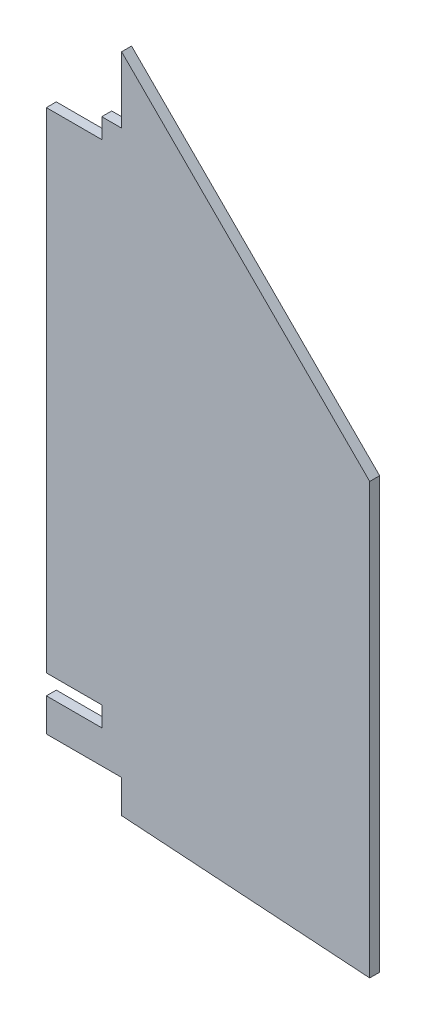
ISO-10303-21;
HEADER;
FILE_DESCRIPTION(('STEP AP214'),'2;1');
FILE_NAME('part.step','',(''),(''),'','','');
FILE_SCHEMA(('AUTOMOTIVE_DESIGN { 1 0 10303 214 1 1 1 1 }'));
ENDSEC;
DATA;
#1=APPLICATION_CONTEXT('core data for automotive mechanical design processes');
#2=APPLICATION_PROTOCOL_DEFINITION('international standard','automotive_design',2000,#1);
#3=PRODUCT_CONTEXT('',#1,'mechanical');
#4=PRODUCT('Part','Part','',(#3));
#5=PRODUCT_RELATED_PRODUCT_CATEGORY('part','',(#4));
#6=PRODUCT_DEFINITION_FORMATION('','',#4);
#7=PRODUCT_DEFINITION_CONTEXT('part definition',#1,'design');
#8=PRODUCT_DEFINITION('design','',#6,#7);
#9=PRODUCT_DEFINITION_SHAPE('','',#8);
#10=(LENGTH_UNIT() NAMED_UNIT(*) SI_UNIT(.MILLI.,.METRE.));
#11=(NAMED_UNIT(*) PLANE_ANGLE_UNIT() SI_UNIT($,.RADIAN.));
#12=(NAMED_UNIT(*) SI_UNIT($,.STERADIAN.) SOLID_ANGLE_UNIT());
#13=UNCERTAINTY_MEASURE_WITH_UNIT(LENGTH_MEASURE(1.E-05),#10,'distance_accuracy_value','');
#14=(GEOMETRIC_REPRESENTATION_CONTEXT(3) GLOBAL_UNCERTAINTY_ASSIGNED_CONTEXT((#13)) GLOBAL_UNIT_ASSIGNED_CONTEXT((#10,
#11,#12)) REPRESENTATION_CONTEXT('',''));
#15=CARTESIAN_POINT('',(0.,0.,0.));
#16=DIRECTION('',(0.,0.,1.));
#17=DIRECTION('',(1.,0.,0.));
#18=AXIS2_PLACEMENT_3D('',#15,#16,#17);
#19=CARTESIAN_POINT('',(-44.9481865284975,7.69430051813452,3.));
#20=DIRECTION('',(0.0665190105237766,0.997785157856609,0.));
#21=DIRECTION('',(-0.997785157856609,0.0665190105237766,0.));
#22=AXIS2_PLACEMENT_3D('',#19,#20,#21);
#23=PLANE('',#22);
#24=DIRECTION('',(0.997785157856609,-0.0665190105237766,0.));
#25=VECTOR('',#24,1.);
#26=CARTESIAN_POINT('',(-44.9481865284975,7.69430051813452,0.));
#27=LINE('',#26,#25);
#28=CARTESIAN_POINT('',(-119.948186528497,12.6943005181347,0.));
#29=VERTEX_POINT('',#28);
#30=CARTESIAN_POINT('',(-44.9481865284975,7.69430051813452,0.));
#31=VERTEX_POINT('',#30);
#32=EDGE_CURVE('E174',#29,#31,#27,.T.);
#33=ORIENTED_EDGE('',*,*,#32,.T.);
#34=DIRECTION('',(0.,0.,-1.));
#35=VECTOR('',#34,1.);
#36=CARTESIAN_POINT('',(-44.9481865284975,7.69430051813452,3.));
#37=LINE('',#36,#35);
#38=CARTESIAN_POINT('',(-44.9481865284975,7.69430051813452,3.));
#39=VERTEX_POINT('',#38);
#40=EDGE_CURVE('E11',#39,#31,#37,.T.);
#41=ORIENTED_EDGE('',*,*,#40,.F.);
#42=DIRECTION('',(0.997785157856609,-0.0665190105237766,0.));
#43=VECTOR('',#42,1.);
#44=CARTESIAN_POINT('',(-44.9481865284975,7.69430051813452,3.));
#45=LINE('',#44,#43);
#46=CARTESIAN_POINT('',(-119.948186528497,12.6943005181347,3.));
#47=VERTEX_POINT('',#46);
#48=EDGE_CURVE('E200',#47,#39,#45,.T.);
#49=ORIENTED_EDGE('',*,*,#48,.F.);
#50=DIRECTION('',(0.,0.,-1.));
#51=VECTOR('',#50,1.);
#52=CARTESIAN_POINT('',(-119.948186528497,12.6943005181347,3.));
#53=LINE('',#52,#51);
#54=EDGE_CURVE('E170',#47,#29,#53,.T.);
#55=ORIENTED_EDGE('',*,*,#54,.T.);
#56=EDGE_LOOP('',(#33,#41,#49,#55));
#57=FACE_BOUND('',#56,.T.);
#58=ADVANCED_FACE('F42',(#57),#23,.F.);
#59=CARTESIAN_POINT('',(-44.9481865284975,7.69430051813452,3.));
#60=DIRECTION('',(-1.,0.,0.));
#61=DIRECTION('',(0.,0.,1.));
#62=AXIS2_PLACEMENT_3D('',#59,#60,#61);
#63=PLANE('',#62);
#64=DIRECTION('',(0.,1.,0.));
#65=VECTOR('',#64,1.);
#66=CARTESIAN_POINT('',(-44.9481865284975,7.69430051813452,0.));
#67=LINE('',#66,#65);
#68=CARTESIAN_POINT('',(-44.9481865284975,137.694300518135,0.));
#69=VERTEX_POINT('',#68);
#70=EDGE_CURVE('E177',#31,#69,#67,.T.);
#71=ORIENTED_EDGE('',*,*,#70,.T.);
#72=DIRECTION('',(0.,0.,-1.));
#73=VECTOR('',#72,1.);
#74=CARTESIAN_POINT('',(-44.9481865284975,137.694300518135,3.));
#75=LINE('',#74,#73);
#76=CARTESIAN_POINT('',(-44.9481865284975,137.694300518135,3.));
#77=VERTEX_POINT('',#76);
#78=EDGE_CURVE('E50',#77,#69,#75,.T.);
#79=ORIENTED_EDGE('',*,*,#78,.F.);
#80=DIRECTION('',(0.,1.,0.));
#81=VECTOR('',#80,1.);
#82=CARTESIAN_POINT('',(-44.9481865284975,7.69430051813452,3.));
#83=LINE('',#82,#81);
#84=EDGE_CURVE('E119',#39,#77,#83,.T.);
#85=ORIENTED_EDGE('',*,*,#84,.F.);
#86=ORIENTED_EDGE('',*,*,#40,.T.);
#87=EDGE_LOOP('',(#71,#79,#85,#86));
#88=FACE_BOUND('',#87,.T.);
#89=ADVANCED_FACE('F288',(#88),#63,.F.);
#90=CARTESIAN_POINT('',(-119.948186528497,212.694300518135,3.));
#91=DIRECTION('',(-0.707106781186548,-0.707106781186547,0.));
#92=DIRECTION('',(0.707106781186547,-0.707106781186548,0.));
#93=AXIS2_PLACEMENT_3D('',#90,#91,#92);
#94=PLANE('',#93);
#95=DIRECTION('',(-0.707106781186547,0.707106781186548,0.));
#96=VECTOR('',#95,1.);
#97=CARTESIAN_POINT('',(-119.948186528497,212.694300518135,0.));
#98=LINE('',#97,#96);
#99=CARTESIAN_POINT('',(-119.948186528497,212.694300518135,0.));
#100=VERTEX_POINT('',#99);
#101=EDGE_CURVE('E179',#69,#100,#98,.T.);
#102=ORIENTED_EDGE('',*,*,#101,.T.);
#103=DIRECTION('',(0.,0.,-1.));
#104=VECTOR('',#103,1.);
#105=CARTESIAN_POINT('',(-119.948186528497,212.694300518135,3.));
#106=LINE('',#105,#104);
#107=CARTESIAN_POINT('',(-119.948186528497,212.694300518135,3.));
#108=VERTEX_POINT('',#107);
#109=EDGE_CURVE('E225',#108,#100,#106,.T.);
#110=ORIENTED_EDGE('',*,*,#109,.F.);
#111=DIRECTION('',(-0.707106781186547,0.707106781186548,0.));
#112=VECTOR('',#111,1.);
#113=CARTESIAN_POINT('',(-119.948186528497,212.694300518135,3.));
#114=LINE('',#113,#112);
#115=EDGE_CURVE('E233',#77,#108,#114,.T.);
#116=ORIENTED_EDGE('',*,*,#115,.F.);
#117=ORIENTED_EDGE('',*,*,#78,.T.);
#118=EDGE_LOOP('',(#102,#110,#116,#117));
#119=FACE_BOUND('',#118,.T.);
#120=ADVANCED_FACE('F231',(#119),#94,.F.);
#121=CARTESIAN_POINT('',(-119.948186528497,192.694300518135,3.));
#122=DIRECTION('',(1.,0.,0.));
#123=DIRECTION('',(0.,1.,0.));
#124=AXIS2_PLACEMENT_3D('',#121,#122,#123);
#125=PLANE('',#124);
#126=DIRECTION('',(0.,-1.,0.));
#127=VECTOR('',#126,1.);
#128=CARTESIAN_POINT('',(-119.948186528497,192.694300518135,0.));
#129=LINE('',#128,#127);
#130=CARTESIAN_POINT('',(-119.948186528497,192.694300518135,0.));
#131=VERTEX_POINT('',#130);
#132=EDGE_CURVE('E181',#100,#131,#129,.T.);
#133=ORIENTED_EDGE('',*,*,#132,.T.);
#134=DIRECTION('',(0.,0.,-1.));
#135=VECTOR('',#134,1.);
#136=CARTESIAN_POINT('',(-119.948186528497,192.694300518135,3.));
#137=LINE('',#136,#135);
#138=CARTESIAN_POINT('',(-119.948186528497,192.694300518135,3.));
#139=VERTEX_POINT('',#138);
#140=EDGE_CURVE('E222',#139,#131,#137,.T.);
#141=ORIENTED_EDGE('',*,*,#140,.F.);
#142=DIRECTION('',(0.,-1.,0.));
#143=VECTOR('',#142,1.);
#144=CARTESIAN_POINT('',(-119.948186528497,192.694300518135,3.));
#145=LINE('',#144,#143);
#146=EDGE_CURVE('E251',#108,#139,#145,.T.);
#147=ORIENTED_EDGE('',*,*,#146,.F.);
#148=ORIENTED_EDGE('',*,*,#109,.T.);
#149=EDGE_LOOP('',(#133,#141,#147,#148));
#150=FACE_BOUND('',#149,.T.);
#151=ADVANCED_FACE('F242',(#150),#125,.F.);
#152=CARTESIAN_POINT('',(-119.948186528497,192.694300518135,3.));
#153=DIRECTION('',(0.,-1.,0.));
#154=DIRECTION('',(0.,0.,-1.));
#155=AXIS2_PLACEMENT_3D('',#152,#153,#154);
#156=PLANE('',#155);
#157=DIRECTION('',(-1.,0.,0.));
#158=VECTOR('',#157,1.);
#159=CARTESIAN_POINT('',(-119.948186528497,192.694300518135,0.));
#160=LINE('',#159,#158);
#161=CARTESIAN_POINT('',(-125.948186528497,192.694300518135,0.));
#162=VERTEX_POINT('',#161);
#163=EDGE_CURVE('E183',#131,#162,#160,.T.);
#164=ORIENTED_EDGE('',*,*,#163,.T.);
#165=DIRECTION('',(0.,0.,-1.));
#166=VECTOR('',#165,1.);
#167=CARTESIAN_POINT('',(-125.948186528497,192.694300518135,3.));
#168=LINE('',#167,#166);
#169=CARTESIAN_POINT('',(-125.948186528497,192.694300518135,3.));
#170=VERTEX_POINT('',#169);
#171=EDGE_CURVE('E219',#170,#162,#168,.T.);
#172=ORIENTED_EDGE('',*,*,#171,.F.);
#173=DIRECTION('',(-1.,0.,0.));
#174=VECTOR('',#173,1.);
#175=CARTESIAN_POINT('',(-119.948186528497,192.694300518135,3.));
#176=LINE('',#175,#174);
#177=EDGE_CURVE('E248',#139,#170,#176,.T.);
#178=ORIENTED_EDGE('',*,*,#177,.F.);
#179=ORIENTED_EDGE('',*,*,#140,.T.);
#180=EDGE_LOOP('',(#164,#172,#178,#179));
#181=FACE_BOUND('',#180,.T.);
#182=ADVANCED_FACE('F246',(#181),#156,.F.);
#183=CARTESIAN_POINT('',(-125.948186528497,192.694300518135,3.));
#184=DIRECTION('',(1.,0.,0.));
#185=DIRECTION('',(0.,0.,-1.));
#186=AXIS2_PLACEMENT_3D('',#183,#184,#185);
#187=PLANE('',#186);
#188=DIRECTION('',(0.,-1.,0.));
#189=VECTOR('',#188,1.);
#190=CARTESIAN_POINT('',(-125.948186528497,192.694300518135,0.));
#191=LINE('',#190,#189);
#192=CARTESIAN_POINT('',(-125.948186528497,186.694300518135,0.));
#193=VERTEX_POINT('',#192);
#194=EDGE_CURVE('E185',#162,#193,#191,.T.);
#195=ORIENTED_EDGE('',*,*,#194,.T.);
#196=DIRECTION('',(0.,0.,-1.));
#197=VECTOR('',#196,1.);
#198=CARTESIAN_POINT('',(-125.948186528497,186.694300518135,3.));
#199=LINE('',#198,#197);
#200=CARTESIAN_POINT('',(-125.948186528497,186.694300518135,3.));
#201=VERTEX_POINT('',#200);
#202=EDGE_CURVE('E216',#201,#193,#199,.T.);
#203=ORIENTED_EDGE('',*,*,#202,.F.);
#204=DIRECTION('',(0.,-1.,0.));
#205=VECTOR('',#204,1.);
#206=CARTESIAN_POINT('',(-125.948186528497,192.694300518135,3.));
#207=LINE('',#206,#205);
#208=EDGE_CURVE('E250',#170,#201,#207,.T.);
#209=ORIENTED_EDGE('',*,*,#208,.F.);
#210=ORIENTED_EDGE('',*,*,#171,.T.);
#211=EDGE_LOOP('',(#195,#203,#209,#210));
#212=FACE_BOUND('',#211,.T.);
#213=ADVANCED_FACE('F301',(#212),#187,.F.);
#214=CARTESIAN_POINT('',(-125.948186528497,186.694300518135,3.));
#215=DIRECTION('',(0.,-1.,0.));
#216=DIRECTION('',(0.,0.,-1.));
#217=AXIS2_PLACEMENT_3D('',#214,#215,#216);
#218=PLANE('',#217);
#219=DIRECTION('',(-1.,0.,0.));
#220=VECTOR('',#219,1.);
#221=CARTESIAN_POINT('',(-125.948186528497,186.694300518135,0.));
#222=LINE('',#221,#220);
#223=CARTESIAN_POINT('',(-142.698186528497,186.694300518135,0.));
#224=VERTEX_POINT('',#223);
#225=EDGE_CURVE('E187',#193,#224,#222,.T.);
#226=ORIENTED_EDGE('',*,*,#225,.T.);
#227=DIRECTION('',(0.,0.,-1.));
#228=VECTOR('',#227,1.);
#229=CARTESIAN_POINT('',(-142.698186528497,186.694300518135,3.));
#230=LINE('',#229,#228);
#231=CARTESIAN_POINT('',(-142.698186528497,186.694300518135,3.));
#232=VERTEX_POINT('',#231);
#233=EDGE_CURVE('E213',#232,#224,#230,.T.);
#234=ORIENTED_EDGE('',*,*,#233,.F.);
#235=DIRECTION('',(-1.,0.,0.));
#236=VECTOR('',#235,1.);
#237=CARTESIAN_POINT('',(-125.948186528497,186.694300518135,3.));
#238=LINE('',#237,#236);
#239=EDGE_CURVE('E253',#201,#232,#238,.T.);
#240=ORIENTED_EDGE('',*,*,#239,.F.);
#241=ORIENTED_EDGE('',*,*,#202,.T.);
#242=EDGE_LOOP('',(#226,#234,#240,#241));
#243=FACE_BOUND('',#242,.T.);
#244=ADVANCED_FACE('F304',(#243),#218,.F.);
#245=CARTESIAN_POINT('',(-142.698186528497,38.6943005181347,3.));
#246=DIRECTION('',(1.,0.,0.));
#247=DIRECTION('',(0.,0.,-1.));
#248=AXIS2_PLACEMENT_3D('',#245,#246,#247);
#249=PLANE('',#248);
#250=DIRECTION('',(0.,-1.,0.));
#251=VECTOR('',#250,1.);
#252=CARTESIAN_POINT('',(-142.698186528497,38.6943005181347,0.));
#253=LINE('',#252,#251);
#254=CARTESIAN_POINT('',(-142.698186528497,38.6943005181347,0.));
#255=VERTEX_POINT('',#254);
#256=EDGE_CURVE('E189',#224,#255,#253,.T.);
#257=ORIENTED_EDGE('',*,*,#256,.T.);
#258=DIRECTION('',(0.,0.,-1.));
#259=VECTOR('',#258,1.);
#260=CARTESIAN_POINT('',(-142.698186528497,38.6943005181347,3.));
#261=LINE('',#260,#259);
#262=CARTESIAN_POINT('',(-142.698186528497,38.6943005181347,3.));
#263=VERTEX_POINT('',#262);
#264=EDGE_CURVE('E210',#263,#255,#261,.T.);
#265=ORIENTED_EDGE('',*,*,#264,.F.);
#266=DIRECTION('',(0.,-1.,0.));
#267=VECTOR('',#266,1.);
#268=CARTESIAN_POINT('',(-142.698186528497,38.6943005181347,3.));
#269=LINE('',#268,#267);
#270=EDGE_CURVE('E259',#232,#263,#269,.T.);
#271=ORIENTED_EDGE('',*,*,#270,.F.);
#272=ORIENTED_EDGE('',*,*,#233,.T.);
#273=EDGE_LOOP('',(#257,#265,#271,#272));
#274=FACE_BOUND('',#273,.T.);
#275=ADVANCED_FACE('F308',(#274),#249,.F.);
#276=CARTESIAN_POINT('',(-125.948186528497,38.6943005181347,3.));
#277=DIRECTION('',(0.,1.,0.));
#278=DIRECTION('',(0.,0.,1.));
#279=AXIS2_PLACEMENT_3D('',#276,#277,#278);
#280=PLANE('',#279);
#281=DIRECTION('',(1.,0.,0.));
#282=VECTOR('',#281,1.);
#283=CARTESIAN_POINT('',(-125.948186528497,38.6943005181347,0.));
#284=LINE('',#283,#282);
#285=CARTESIAN_POINT('',(-125.948186528497,38.6943005181347,0.));
#286=VERTEX_POINT('',#285);
#287=EDGE_CURVE('E191',#255,#286,#284,.T.);
#288=ORIENTED_EDGE('',*,*,#287,.T.);
#289=DIRECTION('',(0.,0.,-1.));
#290=VECTOR('',#289,1.);
#291=CARTESIAN_POINT('',(-125.948186528497,38.6943005181347,3.));
#292=LINE('',#291,#290);
#293=CARTESIAN_POINT('',(-125.948186528497,38.6943005181347,3.));
#294=VERTEX_POINT('',#293);
#295=EDGE_CURVE('E207',#294,#286,#292,.T.);
#296=ORIENTED_EDGE('',*,*,#295,.F.);
#297=DIRECTION('',(1.,0.,0.));
#298=VECTOR('',#297,1.);
#299=CARTESIAN_POINT('',(-125.948186528497,38.6943005181347,3.));
#300=LINE('',#299,#298);
#301=EDGE_CURVE('E261',#263,#294,#300,.T.);
#302=ORIENTED_EDGE('',*,*,#301,.F.);
#303=ORIENTED_EDGE('',*,*,#264,.T.);
#304=EDGE_LOOP('',(#288,#296,#302,#303));
#305=FACE_BOUND('',#304,.T.);
#306=ADVANCED_FACE('F312',(#305),#280,.F.);
#307=CARTESIAN_POINT('',(-125.948186528497,32.6943005181347,3.));
#308=DIRECTION('',(1.,0.,0.));
#309=DIRECTION('',(0.,0.,-1.));
#310=AXIS2_PLACEMENT_3D('',#307,#308,#309);
#311=PLANE('',#310);
#312=DIRECTION('',(0.,-1.,0.));
#313=VECTOR('',#312,1.);
#314=CARTESIAN_POINT('',(-125.948186528497,32.6943005181347,0.));
#315=LINE('',#314,#313);
#316=CARTESIAN_POINT('',(-125.948186528497,32.6943005181347,0.));
#317=VERTEX_POINT('',#316);
#318=EDGE_CURVE('E193',#286,#317,#315,.T.);
#319=ORIENTED_EDGE('',*,*,#318,.T.);
#320=DIRECTION('',(0.,0.,-1.));
#321=VECTOR('',#320,1.);
#322=CARTESIAN_POINT('',(-125.948186528497,32.6943005181347,3.));
#323=LINE('',#322,#321);
#324=CARTESIAN_POINT('',(-125.948186528497,32.6943005181347,3.));
#325=VERTEX_POINT('',#324);
#326=EDGE_CURVE('E204',#325,#317,#323,.T.);
#327=ORIENTED_EDGE('',*,*,#326,.F.);
#328=DIRECTION('',(0.,-1.,0.));
#329=VECTOR('',#328,1.);
#330=CARTESIAN_POINT('',(-125.948186528497,32.6943005181347,3.));
#331=LINE('',#330,#329);
#332=EDGE_CURVE('E263',#294,#325,#331,.T.);
#333=ORIENTED_EDGE('',*,*,#332,.F.);
#334=ORIENTED_EDGE('',*,*,#295,.T.);
#335=EDGE_LOOP('',(#319,#327,#333,#334));
#336=FACE_BOUND('',#335,.T.);
#337=ADVANCED_FACE('F269',(#336),#311,.F.);
#338=CARTESIAN_POINT('',(-142.698186528497,32.6943005181347,3.));
#339=DIRECTION('',(0.,-1.,0.));
#340=DIRECTION('',(0.,0.,-1.));
#341=AXIS2_PLACEMENT_3D('',#338,#339,#340);
#342=PLANE('',#341);
#343=DIRECTION('',(-1.,0.,0.));
#344=VECTOR('',#343,1.);
#345=CARTESIAN_POINT('',(-142.698186528497,32.6943005181347,0.));
#346=LINE('',#345,#344);
#347=CARTESIAN_POINT('',(-142.698186528497,32.6943005181347,0.));
#348=VERTEX_POINT('',#347);
#349=EDGE_CURVE('E195',#317,#348,#346,.T.);
#350=ORIENTED_EDGE('',*,*,#349,.T.);
#351=DIRECTION('',(0.,0.,-1.));
#352=VECTOR('',#351,1.);
#353=CARTESIAN_POINT('',(-142.698186528497,32.6943005181347,3.));
#354=LINE('',#353,#352);
#355=CARTESIAN_POINT('',(-142.698186528497,32.6943005181347,3.));
#356=VERTEX_POINT('',#355);
#357=EDGE_CURVE('E165',#356,#348,#354,.T.);
#358=ORIENTED_EDGE('',*,*,#357,.F.);
#359=DIRECTION('',(-1.,0.,0.));
#360=VECTOR('',#359,1.);
#361=CARTESIAN_POINT('',(-142.698186528497,32.6943005181347,3.));
#362=LINE('',#361,#360);
#363=EDGE_CURVE('E156',#325,#356,#362,.T.);
#364=ORIENTED_EDGE('',*,*,#363,.F.);
#365=ORIENTED_EDGE('',*,*,#326,.T.);
#366=EDGE_LOOP('',(#350,#358,#364,#365));
#367=FACE_BOUND('',#366,.T.);
#368=ADVANCED_FACE('F273',(#367),#342,.F.);
#369=CARTESIAN_POINT('',(-142.698186528497,22.6943005181347,3.));
#370=DIRECTION('',(1.,0.,0.));
#371=DIRECTION('',(0.,0.,-1.));
#372=AXIS2_PLACEMENT_3D('',#369,#370,#371);
#373=PLANE('',#372);
#374=DIRECTION('',(0.,-1.,0.));
#375=VECTOR('',#374,1.);
#376=CARTESIAN_POINT('',(-142.698186528497,22.6943005181347,0.));
#377=LINE('',#376,#375);
#378=CARTESIAN_POINT('',(-142.698186528497,22.6943005181347,0.));
#379=VERTEX_POINT('',#378);
#380=EDGE_CURVE('E164',#348,#379,#377,.T.);
#381=ORIENTED_EDGE('',*,*,#380,.T.);
#382=DIRECTION('',(0.,0.,-1.));
#383=VECTOR('',#382,1.);
#384=CARTESIAN_POINT('',(-142.698186528497,22.6943005181347,3.));
#385=LINE('',#384,#383);
#386=CARTESIAN_POINT('',(-142.698186528497,22.6943005181347,3.));
#387=VERTEX_POINT('',#386);
#388=EDGE_CURVE('E161',#387,#379,#385,.T.);
#389=ORIENTED_EDGE('',*,*,#388,.F.);
#390=DIRECTION('',(0.,-1.,0.));
#391=VECTOR('',#390,1.);
#392=CARTESIAN_POINT('',(-142.698186528497,22.6943005181347,3.));
#393=LINE('',#392,#391);
#394=EDGE_CURVE('E150',#356,#387,#393,.T.);
#395=ORIENTED_EDGE('',*,*,#394,.F.);
#396=ORIENTED_EDGE('',*,*,#357,.T.);
#397=EDGE_LOOP('',(#381,#389,#395,#396));
#398=FACE_BOUND('',#397,.T.);
#399=ADVANCED_FACE('F162',(#398),#373,.F.);
#400=CARTESIAN_POINT('',(-119.948186528497,22.6943005181347,3.));
#401=DIRECTION('',(0.,1.,0.));
#402=DIRECTION('',(-1.,0.,0.));
#403=AXIS2_PLACEMENT_3D('',#400,#401,#402);
#404=PLANE('',#403);
#405=DIRECTION('',(1.,0.,0.));
#406=VECTOR('',#405,1.);
#407=CARTESIAN_POINT('',(-119.948186528497,22.6943005181347,0.));
#408=LINE('',#407,#406);
#409=CARTESIAN_POINT('',(-119.948186528497,22.6943005181347,0.));
#410=VERTEX_POINT('',#409);
#411=EDGE_CURVE('E105',#379,#410,#408,.T.);
#412=ORIENTED_EDGE('',*,*,#411,.T.);
#413=DIRECTION('',(0.,0.,-1.));
#414=VECTOR('',#413,1.);
#415=CARTESIAN_POINT('',(-119.948186528497,22.6943005181347,3.));
#416=LINE('',#415,#414);
#417=CARTESIAN_POINT('',(-119.948186528497,22.6943005181347,3.));
#418=VERTEX_POINT('',#417);
#419=EDGE_CURVE('E166',#418,#410,#416,.T.);
#420=ORIENTED_EDGE('',*,*,#419,.F.);
#421=DIRECTION('',(1.,0.,0.));
#422=VECTOR('',#421,1.);
#423=CARTESIAN_POINT('',(-119.948186528497,22.6943005181347,3.));
#424=LINE('',#423,#422);
#425=EDGE_CURVE('E154',#387,#418,#424,.T.);
#426=ORIENTED_EDGE('',*,*,#425,.F.);
#427=ORIENTED_EDGE('',*,*,#388,.T.);
#428=EDGE_LOOP('',(#412,#420,#426,#427));
#429=FACE_BOUND('',#428,.T.);
#430=ADVANCED_FACE('F168',(#429),#404,.F.);
#431=CARTESIAN_POINT('',(-119.948186528497,12.6943005181347,3.));
#432=DIRECTION('',(1.,0.,0.));
#433=DIRECTION('',(0.,0.,-1.));
#434=AXIS2_PLACEMENT_3D('',#431,#432,#433);
#435=PLANE('',#434);
#436=DIRECTION('',(0.,-1.,0.));
#437=VECTOR('',#436,1.);
#438=CARTESIAN_POINT('',(-119.948186528497,12.6943005181347,0.));
#439=LINE('',#438,#437);
#440=EDGE_CURVE('E111',#410,#29,#439,.T.);
#441=ORIENTED_EDGE('',*,*,#440,.T.);
#442=ORIENTED_EDGE('',*,*,#54,.F.);
#443=DIRECTION('',(0.,-1.,0.));
#444=VECTOR('',#443,1.);
#445=CARTESIAN_POINT('',(-119.948186528497,12.6943005181347,3.));
#446=LINE('',#445,#444);
#447=EDGE_CURVE('E58',#418,#47,#446,.T.);
#448=ORIENTED_EDGE('',*,*,#447,.F.);
#449=ORIENTED_EDGE('',*,*,#419,.T.);
#450=EDGE_LOOP('',(#441,#442,#448,#449));
#451=FACE_BOUND('',#450,.T.);
#452=ADVANCED_FACE('F277',(#451),#435,.F.);
#453=CARTESIAN_POINT('',(0.,0.,3.));
#454=DIRECTION('',(0.,0.,-1.));
#455=DIRECTION('',(-1.,0.,0.));
#456=AXIS2_PLACEMENT_3D('',#453,#454,#455);
#457=PLANE('',#456);
#458=ORIENTED_EDGE('',*,*,#48,.T.);
#459=ORIENTED_EDGE('',*,*,#84,.T.);
#460=ORIENTED_EDGE('',*,*,#115,.T.);
#461=ORIENTED_EDGE('',*,*,#146,.T.);
#462=ORIENTED_EDGE('',*,*,#177,.T.);
#463=ORIENTED_EDGE('',*,*,#208,.T.);
#464=ORIENTED_EDGE('',*,*,#239,.T.);
#465=ORIENTED_EDGE('',*,*,#270,.T.);
#466=ORIENTED_EDGE('',*,*,#301,.T.);
#467=ORIENTED_EDGE('',*,*,#332,.T.);
#468=ORIENTED_EDGE('',*,*,#363,.T.);
#469=ORIENTED_EDGE('',*,*,#394,.T.);
#470=ORIENTED_EDGE('',*,*,#425,.T.);
#471=ORIENTED_EDGE('',*,*,#447,.T.);
#472=EDGE_LOOP('',(#458,#459,#460,#461,#462,#463,#464,#465,#466,#467,#468,#469,#470,#471));
#473=FACE_BOUND('',#472,.T.);
#474=ADVANCED_FACE('F152',(#473),#457,.F.);
#475=CARTESIAN_POINT('',(0.,0.,0.));
#476=DIRECTION('',(0.,0.,-1.));
#477=DIRECTION('',(-1.,0.,0.));
#478=AXIS2_PLACEMENT_3D('',#475,#476,#477);
#479=PLANE('',#478);
#480=ORIENTED_EDGE('',*,*,#32,.F.);
#481=ORIENTED_EDGE('',*,*,#440,.F.);
#482=ORIENTED_EDGE('',*,*,#411,.F.);
#483=ORIENTED_EDGE('',*,*,#380,.F.);
#484=ORIENTED_EDGE('',*,*,#349,.F.);
#485=ORIENTED_EDGE('',*,*,#318,.F.);
#486=ORIENTED_EDGE('',*,*,#287,.F.);
#487=ORIENTED_EDGE('',*,*,#256,.F.);
#488=ORIENTED_EDGE('',*,*,#225,.F.);
#489=ORIENTED_EDGE('',*,*,#194,.F.);
#490=ORIENTED_EDGE('',*,*,#163,.F.);
#491=ORIENTED_EDGE('',*,*,#132,.F.);
#492=ORIENTED_EDGE('',*,*,#101,.F.);
#493=ORIENTED_EDGE('',*,*,#70,.F.);
#494=EDGE_LOOP('',(#480,#481,#482,#483,#484,#485,#486,#487,#488,#489,#490,#491,#492,#493));
#495=FACE_BOUND('',#494,.T.);
#496=ADVANCED_FACE('F237',(#495),#479,.T.);
#497=CLOSED_SHELL('',(#58,#89,#120,#151,#182,#213,#244,#275,#306,#337,#368,#399,#430,#452,#474,#496));
#498=MANIFOLD_SOLID_BREP('B2',#497);
#499=ADVANCED_BREP_SHAPE_REPRESENTATION('',(#18,#498),#14);
#500=SHAPE_DEFINITION_REPRESENTATION(#9,#499);
ENDSEC;
END-ISO-10303-21;
